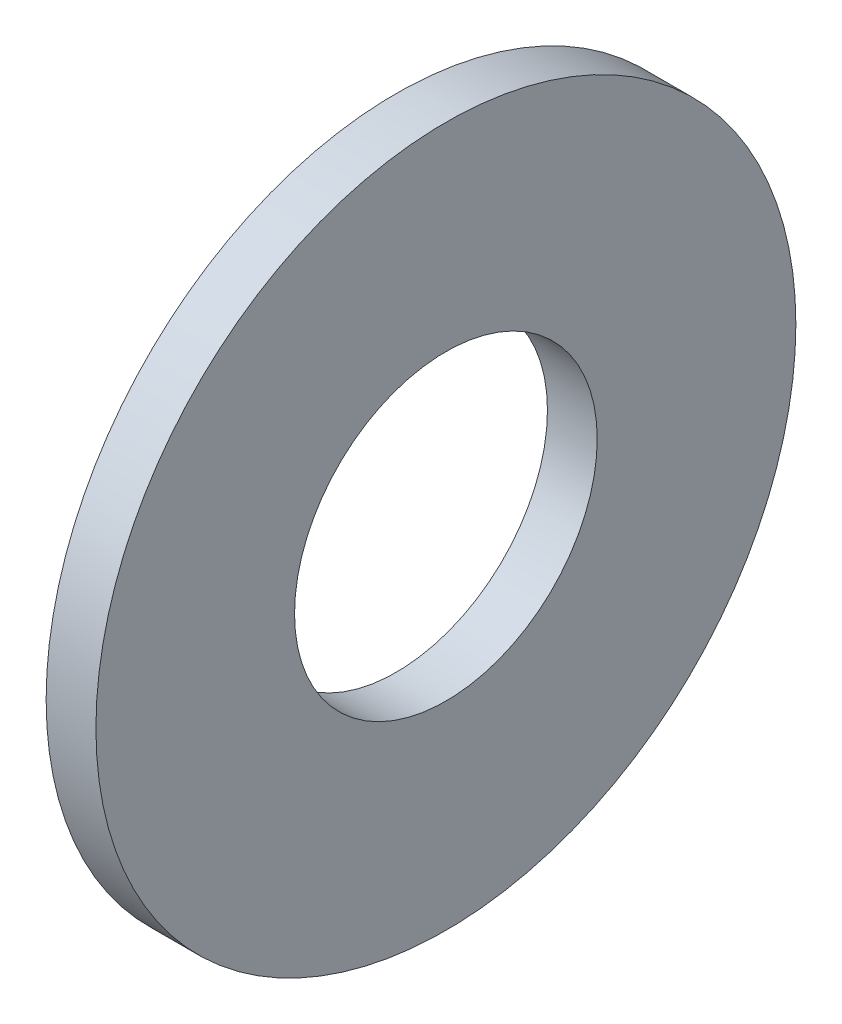
ISO-10303-21;
HEADER;
FILE_DESCRIPTION(('STEP AP214'),'2;1');
FILE_NAME('part.step','',(''),(''),'','','');
FILE_SCHEMA(('AUTOMOTIVE_DESIGN { 1 0 10303 214 1 1 1 1 }'));
ENDSEC;
DATA;
#1=APPLICATION_CONTEXT('core data for automotive mechanical design processes');
#2=APPLICATION_PROTOCOL_DEFINITION('international standard','automotive_design',2000,#1);
#3=PRODUCT_CONTEXT('',#1,'mechanical');
#4=PRODUCT('Part','Part','',(#3));
#5=PRODUCT_RELATED_PRODUCT_CATEGORY('part','',(#4));
#6=PRODUCT_DEFINITION_FORMATION('','',#4);
#7=PRODUCT_DEFINITION_CONTEXT('part definition',#1,'design');
#8=PRODUCT_DEFINITION('design','',#6,#7);
#9=PRODUCT_DEFINITION_SHAPE('','',#8);
#10=(LENGTH_UNIT() NAMED_UNIT(*) SI_UNIT(.MILLI.,.METRE.));
#11=(NAMED_UNIT(*) PLANE_ANGLE_UNIT() SI_UNIT($,.RADIAN.));
#12=(NAMED_UNIT(*) SI_UNIT($,.STERADIAN.) SOLID_ANGLE_UNIT());
#13=UNCERTAINTY_MEASURE_WITH_UNIT(LENGTH_MEASURE(1.E-05),#10,'distance_accuracy_value','');
#14=(GEOMETRIC_REPRESENTATION_CONTEXT(3) GLOBAL_UNCERTAINTY_ASSIGNED_CONTEXT((#13)) GLOBAL_UNIT_ASSIGNED_CONTEXT((#10,
#11,#12)) REPRESENTATION_CONTEXT('',''));
#15=CARTESIAN_POINT('',(0.,0.,0.));
#16=DIRECTION('',(0.,0.,1.));
#17=DIRECTION('',(1.,0.,0.));
#18=AXIS2_PLACEMENT_3D('',#15,#16,#17);
#19=CARTESIAN_POINT('',(-34.9249999999999,0.,0.));
#20=DIRECTION('',(-1.,0.,0.));
#21=DIRECTION('',(0.,0.,1.));
#22=AXIS2_PLACEMENT_3D('',#19,#20,#21);
#23=CYLINDRICAL_SURFACE('',#22,19.46);
#24=CARTESIAN_POINT('',(0.,0.,0.));
#25=DIRECTION('',(-1.,0.,0.));
#26=DIRECTION('',(0.,0.,1.));
#27=AXIS2_PLACEMENT_3D('',#24,#25,#26);
#28=CIRCLE('',#27,19.46);
#29=CARTESIAN_POINT('',(0.,0.,19.46));
#30=VERTEX_POINT('',#29);
#31=EDGE_CURVE('E10',#30,#30,#28,.T.);
#32=ORIENTED_EDGE('',*,*,#31,.F.);
#33=EDGE_LOOP('',(#32));
#34=FACE_BOUND('',#33,.T.);
#35=CARTESIAN_POINT('',(-6.4,0.,0.));
#36=DIRECTION('',(-1.,0.,0.));
#37=DIRECTION('',(0.,0.,1.));
#38=AXIS2_PLACEMENT_3D('',#35,#36,#37);
#39=CIRCLE('',#38,19.46);
#40=CARTESIAN_POINT('',(-6.4,0.,19.46));
#41=VERTEX_POINT('',#40);
#42=EDGE_CURVE('E44',#41,#41,#39,.T.);
#43=ORIENTED_EDGE('',*,*,#42,.T.);
#44=EDGE_LOOP('',(#43));
#45=FACE_BOUND('',#44,.T.);
#46=ADVANCED_FACE('F30',(#34,#45),#23,.F.);
#47=CARTESIAN_POINT('',(0.,19.46,0.));
#48=DIRECTION('',(-1.,0.,0.));
#49=DIRECTION('',(0.,0.,1.));
#50=AXIS2_PLACEMENT_3D('',#47,#48,#49);
#51=PLANE('',#50);
#52=CARTESIAN_POINT('',(0.,0.,0.));
#53=DIRECTION('',(-1.,0.,0.));
#54=DIRECTION('',(0.,0.,1.));
#55=AXIS2_PLACEMENT_3D('',#52,#53,#54);
#56=CIRCLE('',#55,45.);
#57=CARTESIAN_POINT('',(0.,0.,45.));
#58=VERTEX_POINT('',#57);
#59=EDGE_CURVE('E36',#58,#58,#56,.T.);
#60=ORIENTED_EDGE('',*,*,#59,.F.);
#61=EDGE_LOOP('',(#60));
#62=FACE_BOUND('',#61,.T.);
#63=ORIENTED_EDGE('',*,*,#31,.T.);
#64=EDGE_LOOP('',(#63));
#65=FACE_BOUND('',#64,.T.);
#66=ADVANCED_FACE('F59',(#62,#65),#51,.F.);
#67=CARTESIAN_POINT('',(-34.9249999999999,0.,0.));
#68=DIRECTION('',(-1.,0.,0.));
#69=DIRECTION('',(0.,0.,1.));
#70=AXIS2_PLACEMENT_3D('',#67,#68,#69);
#71=CYLINDRICAL_SURFACE('',#70,45.);
#72=CARTESIAN_POINT('',(-6.4,0.,0.));
#73=DIRECTION('',(-1.,0.,0.));
#74=DIRECTION('',(0.,0.,1.));
#75=AXIS2_PLACEMENT_3D('',#72,#73,#74);
#76=CIRCLE('',#75,45.);
#77=CARTESIAN_POINT('',(-6.4,0.,45.));
#78=VERTEX_POINT('',#77);
#79=EDGE_CURVE('E40',#78,#78,#76,.T.);
#80=ORIENTED_EDGE('',*,*,#79,.F.);
#81=EDGE_LOOP('',(#80));
#82=FACE_BOUND('',#81,.T.);
#83=ORIENTED_EDGE('',*,*,#59,.T.);
#84=EDGE_LOOP('',(#83));
#85=FACE_BOUND('',#84,.T.);
#86=ADVANCED_FACE('F54',(#82,#85),#71,.T.);
#87=CARTESIAN_POINT('',(-6.4,45.,0.));
#88=DIRECTION('',(1.,0.,0.));
#89=DIRECTION('',(0.,0.,-1.));
#90=AXIS2_PLACEMENT_3D('',#87,#88,#89);
#91=PLANE('',#90);
#92=ORIENTED_EDGE('',*,*,#42,.F.);
#93=EDGE_LOOP('',(#92));
#94=FACE_BOUND('',#93,.T.);
#95=ORIENTED_EDGE('',*,*,#79,.T.);
#96=EDGE_LOOP('',(#95));
#97=FACE_BOUND('',#96,.T.);
#98=ADVANCED_FACE('F51',(#94,#97),#91,.F.);
#99=CLOSED_SHELL('',(#46,#66,#86,#98));
#100=MANIFOLD_SOLID_BREP('B2',#99);
#101=ADVANCED_BREP_SHAPE_REPRESENTATION('',(#18,#100),#14);
#102=SHAPE_DEFINITION_REPRESENTATION(#9,#101);
ENDSEC;
END-ISO-10303-21;
